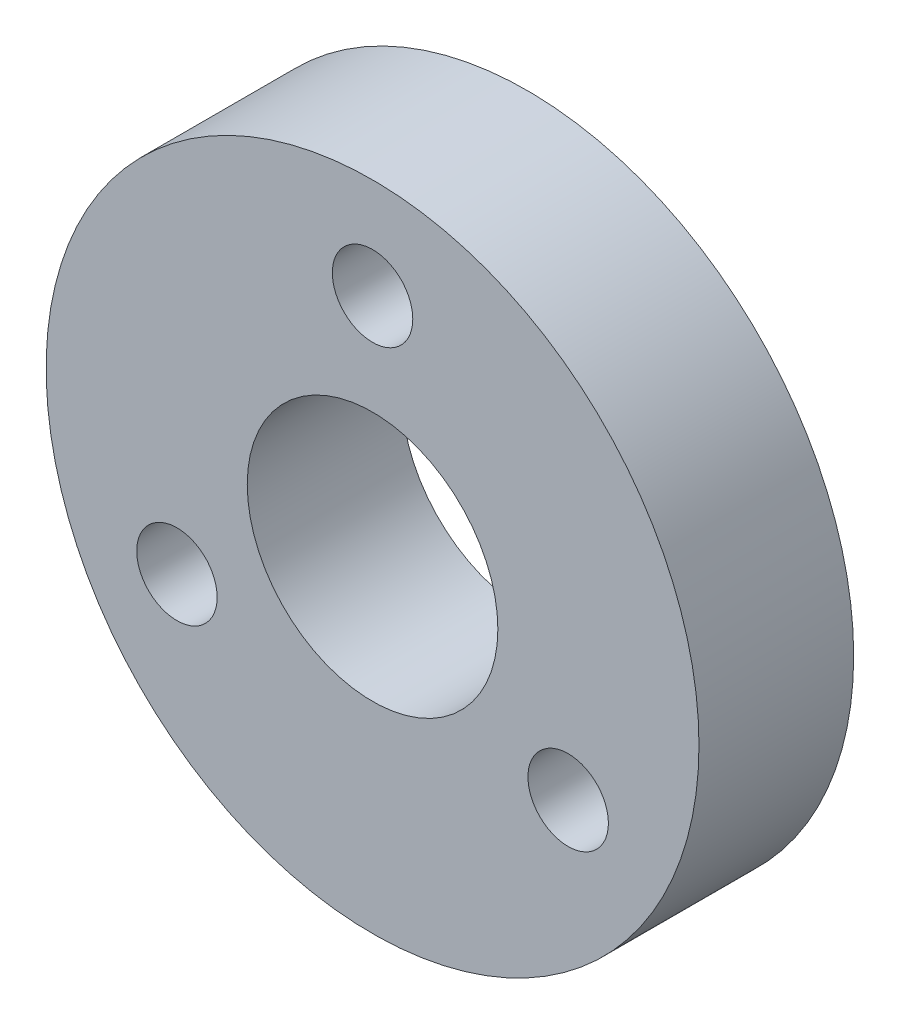
ISO-10303-21;
HEADER;
FILE_DESCRIPTION(('STEP AP214'),'2;1');
FILE_NAME('part.step','',(''),(''),'','','');
FILE_SCHEMA(('AUTOMOTIVE_DESIGN { 1 0 10303 214 1 1 1 1 }'));
ENDSEC;
DATA;
#1=APPLICATION_CONTEXT('core data for automotive mechanical design processes');
#2=APPLICATION_PROTOCOL_DEFINITION('international standard','automotive_design',2000,#1);
#3=PRODUCT_CONTEXT('',#1,'mechanical');
#4=PRODUCT('Part','Part','',(#3));
#5=PRODUCT_RELATED_PRODUCT_CATEGORY('part','',(#4));
#6=PRODUCT_DEFINITION_FORMATION('','',#4);
#7=PRODUCT_DEFINITION_CONTEXT('part definition',#1,'design');
#8=PRODUCT_DEFINITION('design','',#6,#7);
#9=PRODUCT_DEFINITION_SHAPE('','',#8);
#10=(LENGTH_UNIT() NAMED_UNIT(*) SI_UNIT(.MILLI.,.METRE.));
#11=(NAMED_UNIT(*) PLANE_ANGLE_UNIT() SI_UNIT($,.RADIAN.));
#12=(NAMED_UNIT(*) SI_UNIT($,.STERADIAN.) SOLID_ANGLE_UNIT());
#13=UNCERTAINTY_MEASURE_WITH_UNIT(LENGTH_MEASURE(1.E-05),#10,'distance_accuracy_value','');
#14=(GEOMETRIC_REPRESENTATION_CONTEXT(3) GLOBAL_UNCERTAINTY_ASSIGNED_CONTEXT((#13)) GLOBAL_UNIT_ASSIGNED_CONTEXT((#10,
#11,#12)) REPRESENTATION_CONTEXT('',''));
#15=CARTESIAN_POINT('',(0.,0.,0.));
#16=DIRECTION('',(0.,0.,1.));
#17=DIRECTION('',(1.,0.,0.));
#18=AXIS2_PLACEMENT_3D('',#15,#16,#17);
#19=CARTESIAN_POINT('',(0.,0.,5.));
#20=DIRECTION('',(0.,0.,1.));
#21=DIRECTION('',(1.,0.,0.));
#22=AXIS2_PLACEMENT_3D('',#19,#20,#21);
#23=PLANE('',#22);
#24=CARTESIAN_POINT('',(6.3219854476264,-3.65,5.));
#25=DIRECTION('',(0.,0.,1.));
#26=DIRECTION('',(1.,0.,0.));
#27=AXIS2_PLACEMENT_3D('',#24,#25,#26);
#28=CIRCLE('',#27,1.3);
#29=CARTESIAN_POINT('',(7.6219854476264,-3.65,5.));
#30=VERTEX_POINT('',#29);
#31=EDGE_CURVE('E53',#30,#30,#28,.T.);
#32=ORIENTED_EDGE('',*,*,#31,.F.);
#33=EDGE_LOOP('',(#32));
#34=FACE_BOUND('',#33,.T.);
#35=CARTESIAN_POINT('',(0.,0.,5.));
#36=DIRECTION('',(0.,0.,1.));
#37=DIRECTION('',(1.,0.,0.));
#38=AXIS2_PLACEMENT_3D('',#35,#36,#37);
#39=CIRCLE('',#38,4.05);
#40=CARTESIAN_POINT('',(4.05,0.,5.));
#41=VERTEX_POINT('',#40);
#42=EDGE_CURVE('E42',#41,#41,#39,.T.);
#43=ORIENTED_EDGE('',*,*,#42,.F.);
#44=EDGE_LOOP('',(#43));
#45=FACE_BOUND('',#44,.T.);
#46=CARTESIAN_POINT('',(0.,0.,5.));
#47=DIRECTION('',(0.,0.,1.));
#48=DIRECTION('',(1.,0.,0.));
#49=AXIS2_PLACEMENT_3D('',#46,#47,#48);
#50=CIRCLE('',#49,10.55);
#51=CARTESIAN_POINT('',(10.55,0.,5.));
#52=VERTEX_POINT('',#51);
#53=EDGE_CURVE('E10',#52,#52,#50,.T.);
#54=ORIENTED_EDGE('',*,*,#53,.T.);
#55=EDGE_LOOP('',(#54));
#56=FACE_BOUND('',#55,.T.);
#57=CARTESIAN_POINT('',(0.,7.3,5.));
#58=DIRECTION('',(0.,0.,1.));
#59=DIRECTION('',(1.,0.,0.));
#60=AXIS2_PLACEMENT_3D('',#57,#58,#59);
#61=CIRCLE('',#60,1.3);
#62=CARTESIAN_POINT('',(1.3,7.3,5.));
#63=VERTEX_POINT('',#62);
#64=EDGE_CURVE('E47',#63,#63,#61,.T.);
#65=ORIENTED_EDGE('',*,*,#64,.F.);
#66=EDGE_LOOP('',(#65));
#67=FACE_BOUND('',#66,.T.);
#68=CARTESIAN_POINT('',(-6.3219854476264,-3.65,5.));
#69=DIRECTION('',(0.,0.,1.));
#70=DIRECTION('',(1.,0.,0.));
#71=AXIS2_PLACEMENT_3D('',#68,#69,#70);
#72=CIRCLE('',#71,1.3);
#73=CARTESIAN_POINT('',(-5.0219854476264,-3.65,5.));
#74=VERTEX_POINT('',#73);
#75=EDGE_CURVE('E59',#74,#74,#72,.T.);
#76=ORIENTED_EDGE('',*,*,#75,.F.);
#77=EDGE_LOOP('',(#76));
#78=FACE_BOUND('',#77,.T.);
#79=ADVANCED_FACE('F31',(#34,#45,#56,#67,#78),#23,.T.);
#80=CARTESIAN_POINT('',(0.,0.,0.));
#81=DIRECTION('',(0.,0.,1.));
#82=DIRECTION('',(1.,0.,0.));
#83=AXIS2_PLACEMENT_3D('',#80,#81,#82);
#84=PLANE('',#83);
#85=CARTESIAN_POINT('',(0.,0.,0.));
#86=DIRECTION('',(0.,0.,1.));
#87=DIRECTION('',(1.,0.,0.));
#88=AXIS2_PLACEMENT_3D('',#85,#86,#87);
#89=CIRCLE('',#88,10.55);
#90=CARTESIAN_POINT('',(10.55,0.,0.));
#91=VERTEX_POINT('',#90);
#92=EDGE_CURVE('E35',#91,#91,#89,.T.);
#93=ORIENTED_EDGE('',*,*,#92,.F.);
#94=EDGE_LOOP('',(#93));
#95=FACE_BOUND('',#94,.T.);
#96=CARTESIAN_POINT('',(0.,0.,0.));
#97=DIRECTION('',(0.,0.,1.));
#98=DIRECTION('',(1.,0.,0.));
#99=AXIS2_PLACEMENT_3D('',#96,#97,#98);
#100=CIRCLE('',#99,4.05);
#101=CARTESIAN_POINT('',(4.05,0.,0.));
#102=VERTEX_POINT('',#101);
#103=EDGE_CURVE('E44',#102,#102,#100,.T.);
#104=ORIENTED_EDGE('',*,*,#103,.T.);
#105=EDGE_LOOP('',(#104));
#106=FACE_BOUND('',#105,.T.);
#107=CARTESIAN_POINT('',(0.,7.3,0.));
#108=DIRECTION('',(0.,0.,1.));
#109=DIRECTION('',(1.,0.,0.));
#110=AXIS2_PLACEMENT_3D('',#107,#108,#109);
#111=CIRCLE('',#110,1.3);
#112=CARTESIAN_POINT('',(1.3,7.3,0.));
#113=VERTEX_POINT('',#112);
#114=EDGE_CURVE('E50',#113,#113,#111,.T.);
#115=ORIENTED_EDGE('',*,*,#114,.T.);
#116=EDGE_LOOP('',(#115));
#117=FACE_BOUND('',#116,.T.);
#118=CARTESIAN_POINT('',(6.3219854476264,-3.65,0.));
#119=DIRECTION('',(0.,0.,1.));
#120=DIRECTION('',(1.,0.,0.));
#121=AXIS2_PLACEMENT_3D('',#118,#119,#120);
#122=CIRCLE('',#121,1.3);
#123=CARTESIAN_POINT('',(7.6219854476264,-3.65,0.));
#124=VERTEX_POINT('',#123);
#125=EDGE_CURVE('E56',#124,#124,#122,.T.);
#126=ORIENTED_EDGE('',*,*,#125,.T.);
#127=EDGE_LOOP('',(#126));
#128=FACE_BOUND('',#127,.T.);
#129=CARTESIAN_POINT('',(-6.3219854476264,-3.65,0.));
#130=DIRECTION('',(0.,0.,1.));
#131=DIRECTION('',(1.,0.,0.));
#132=AXIS2_PLACEMENT_3D('',#129,#130,#131);
#133=CIRCLE('',#132,1.3);
#134=CARTESIAN_POINT('',(-5.0219854476264,-3.65,0.));
#135=VERTEX_POINT('',#134);
#136=EDGE_CURVE('E62',#135,#135,#133,.T.);
#137=ORIENTED_EDGE('',*,*,#136,.T.);
#138=EDGE_LOOP('',(#137));
#139=FACE_BOUND('',#138,.T.);
#140=ADVANCED_FACE('F72',(#95,#106,#117,#128,#139),#84,.F.);
#141=CARTESIAN_POINT('',(0.,0.,5.));
#142=DIRECTION('',(0.,0.,-1.));
#143=DIRECTION('',(-1.,0.,0.));
#144=AXIS2_PLACEMENT_3D('',#141,#142,#143);
#145=CYLINDRICAL_SURFACE('',#144,10.55);
#146=ORIENTED_EDGE('',*,*,#53,.F.);
#147=EDGE_LOOP('',(#146));
#148=FACE_BOUND('',#147,.T.);
#149=ORIENTED_EDGE('',*,*,#92,.T.);
#150=EDGE_LOOP('',(#149));
#151=FACE_BOUND('',#150,.T.);
#152=ADVANCED_FACE('F33',(#148,#151),#145,.T.);
#153=CARTESIAN_POINT('',(0.,0.,5.));
#154=DIRECTION('',(0.,0.,-1.));
#155=DIRECTION('',(-1.,0.,0.));
#156=AXIS2_PLACEMENT_3D('',#153,#154,#155);
#157=CYLINDRICAL_SURFACE('',#156,4.05);
#158=ORIENTED_EDGE('',*,*,#42,.T.);
#159=EDGE_LOOP('',(#158));
#160=FACE_BOUND('',#159,.T.);
#161=ORIENTED_EDGE('',*,*,#103,.F.);
#162=EDGE_LOOP('',(#161));
#163=FACE_BOUND('',#162,.T.);
#164=ADVANCED_FACE('F82',(#160,#163),#157,.F.);
#165=CARTESIAN_POINT('',(0.,7.3,5.));
#166=DIRECTION('',(0.,0.,-1.));
#167=DIRECTION('',(-1.,0.,0.));
#168=AXIS2_PLACEMENT_3D('',#165,#166,#167);
#169=CYLINDRICAL_SURFACE('',#168,1.3);
#170=ORIENTED_EDGE('',*,*,#64,.T.);
#171=EDGE_LOOP('',(#170));
#172=FACE_BOUND('',#171,.T.);
#173=ORIENTED_EDGE('',*,*,#114,.F.);
#174=EDGE_LOOP('',(#173));
#175=FACE_BOUND('',#174,.T.);
#176=ADVANCED_FACE('F85',(#172,#175),#169,.F.);
#177=CARTESIAN_POINT('',(6.3219854476264,-3.65,5.));
#178=DIRECTION('',(0.,0.,-1.));
#179=DIRECTION('',(-1.,0.,0.));
#180=AXIS2_PLACEMENT_3D('',#177,#178,#179);
#181=CYLINDRICAL_SURFACE('',#180,1.3);
#182=ORIENTED_EDGE('',*,*,#31,.T.);
#183=EDGE_LOOP('',(#182));
#184=FACE_BOUND('',#183,.T.);
#185=ORIENTED_EDGE('',*,*,#125,.F.);
#186=EDGE_LOOP('',(#185));
#187=FACE_BOUND('',#186,.T.);
#188=ADVANCED_FACE('F89',(#184,#187),#181,.F.);
#189=CARTESIAN_POINT('',(-6.3219854476264,-3.65,5.));
#190=DIRECTION('',(0.,0.,-1.));
#191=DIRECTION('',(-1.,0.,0.));
#192=AXIS2_PLACEMENT_3D('',#189,#190,#191);
#193=CYLINDRICAL_SURFACE('',#192,1.3);
#194=ORIENTED_EDGE('',*,*,#75,.T.);
#195=EDGE_LOOP('',(#194));
#196=FACE_BOUND('',#195,.T.);
#197=ORIENTED_EDGE('',*,*,#136,.F.);
#198=EDGE_LOOP('',(#197));
#199=FACE_BOUND('',#198,.T.);
#200=ADVANCED_FACE('F68',(#196,#199),#193,.F.);
#201=CLOSED_SHELL('',(#79,#140,#152,#164,#176,#188,#200));
#202=MANIFOLD_SOLID_BREP('B2',#201);
#203=ADVANCED_BREP_SHAPE_REPRESENTATION('',(#18,#202),#14);
#204=SHAPE_DEFINITION_REPRESENTATION(#9,#203);
ENDSEC;
END-ISO-10303-21;
